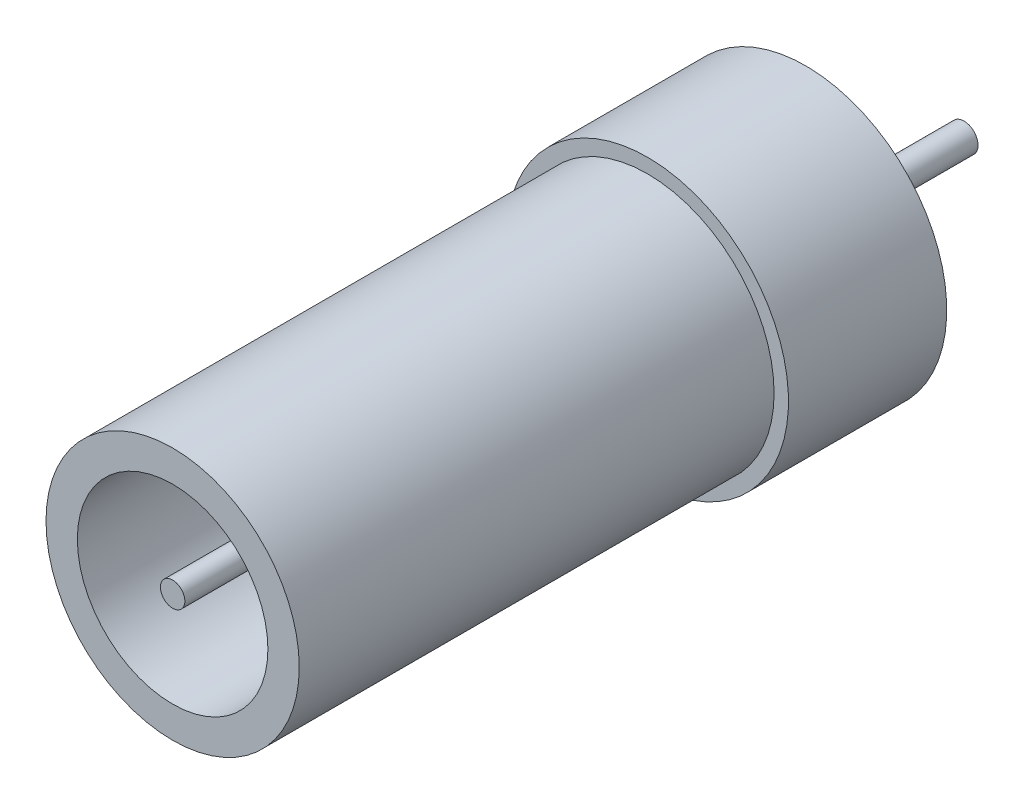
ISO-10303-21;
HEADER;
FILE_DESCRIPTION(('STEP AP214'),'2;1');
FILE_NAME('part.step','',(''),(''),'','','');
FILE_SCHEMA(('AUTOMOTIVE_DESIGN { 1 0 10303 214 1 1 1 1 }'));
ENDSEC;
DATA;
#1=APPLICATION_CONTEXT('core data for automotive mechanical design processes');
#2=APPLICATION_PROTOCOL_DEFINITION('international standard','automotive_design',2000,#1);
#3=PRODUCT_CONTEXT('',#1,'mechanical');
#4=PRODUCT('Part','Part','',(#3));
#5=PRODUCT_RELATED_PRODUCT_CATEGORY('part','',(#4));
#6=PRODUCT_DEFINITION_FORMATION('','',#4);
#7=PRODUCT_DEFINITION_CONTEXT('part definition',#1,'design');
#8=PRODUCT_DEFINITION('design','',#6,#7);
#9=PRODUCT_DEFINITION_SHAPE('','',#8);
#10=(LENGTH_UNIT() NAMED_UNIT(*) SI_UNIT(.MILLI.,.METRE.));
#11=(NAMED_UNIT(*) PLANE_ANGLE_UNIT() SI_UNIT($,.RADIAN.));
#12=(NAMED_UNIT(*) SI_UNIT($,.STERADIAN.) SOLID_ANGLE_UNIT());
#13=UNCERTAINTY_MEASURE_WITH_UNIT(LENGTH_MEASURE(1.E-05),#10,'distance_accuracy_value','');
#14=(GEOMETRIC_REPRESENTATION_CONTEXT(3) GLOBAL_UNCERTAINTY_ASSIGNED_CONTEXT((#13)) GLOBAL_UNIT_ASSIGNED_CONTEXT((#10,
#11,#12)) REPRESENTATION_CONTEXT('',''));
#15=CARTESIAN_POINT('',(0.,0.,0.));
#16=DIRECTION('',(0.,0.,1.));
#17=DIRECTION('',(1.,0.,0.));
#18=AXIS2_PLACEMENT_3D('',#15,#16,#17);
#19=CARTESIAN_POINT('',(0.,0.,15.));
#20=DIRECTION('',(0.,0.,1.));
#21=DIRECTION('',(1.,0.,0.));
#22=AXIS2_PLACEMENT_3D('',#19,#20,#21);
#23=PLANE('',#22);
#24=CARTESIAN_POINT('',(0.,0.,15.));
#25=DIRECTION('',(0.,0.,1.));
#26=DIRECTION('',(1.,0.,0.));
#27=AXIS2_PLACEMENT_3D('',#24,#25,#26);
#28=CIRCLE('',#27,3.00978243592516);
#29=CARTESIAN_POINT('',(3.00978243592516,0.,15.));
#30=VERTEX_POINT('',#29);
#31=EDGE_CURVE('E53',#30,#30,#28,.T.);
#32=ORIENTED_EDGE('',*,*,#31,.F.);
#33=EDGE_LOOP('',(#32));
#34=FACE_BOUND('',#33,.T.);
#35=CARTESIAN_POINT('',(0.,0.,15.));
#36=DIRECTION('',(0.,0.,1.));
#37=DIRECTION('',(1.,0.,0.));
#38=AXIS2_PLACEMENT_3D('',#35,#36,#37);
#39=CIRCLE('',#38,4.);
#40=CARTESIAN_POINT('',(4.,0.,15.));
#41=VERTEX_POINT('',#40);
#42=EDGE_CURVE('E10',#41,#41,#39,.T.);
#43=ORIENTED_EDGE('',*,*,#42,.T.);
#44=EDGE_LOOP('',(#43));
#45=FACE_BOUND('',#44,.T.);
#46=ADVANCED_FACE('F39',(#34,#45),#23,.T.);
#47=CARTESIAN_POINT('',(0.,0.,15.));
#48=DIRECTION('',(0.,0.,-1.));
#49=DIRECTION('',(-1.,0.,0.));
#50=AXIS2_PLACEMENT_3D('',#47,#48,#49);
#51=CYLINDRICAL_SURFACE('',#50,4.);
#52=ORIENTED_EDGE('',*,*,#42,.F.);
#53=EDGE_LOOP('',(#52));
#54=FACE_BOUND('',#53,.T.);
#55=CARTESIAN_POINT('',(0.,0.,0.));
#56=DIRECTION('',(0.,0.,1.));
#57=DIRECTION('',(1.,0.,0.));
#58=AXIS2_PLACEMENT_3D('',#55,#56,#57);
#59=CIRCLE('',#58,4.);
#60=CARTESIAN_POINT('',(4.,0.,0.));
#61=VERTEX_POINT('',#60);
#62=EDGE_CURVE('E43',#61,#61,#59,.T.);
#63=ORIENTED_EDGE('',*,*,#62,.T.);
#64=EDGE_LOOP('',(#63));
#65=FACE_BOUND('',#64,.T.);
#66=ADVANCED_FACE('F41',(#54,#65),#51,.T.);
#67=CARTESIAN_POINT('',(0.,0.,2.));
#68=DIRECTION('',(0.,0.,1.));
#69=DIRECTION('',(1.,0.,0.));
#70=AXIS2_PLACEMENT_3D('',#67,#68,#69);
#71=CYLINDRICAL_SURFACE('',#70,3.00978243592516);
#72=CARTESIAN_POINT('',(0.,0.,2.));
#73=DIRECTION('',(0.,0.,1.));
#74=DIRECTION('',(1.,0.,0.));
#75=AXIS2_PLACEMENT_3D('',#72,#73,#74);
#76=CIRCLE('',#75,3.00978243592516);
#77=CARTESIAN_POINT('',(3.00978243592516,0.,2.));
#78=VERTEX_POINT('',#77);
#79=EDGE_CURVE('E48',#78,#78,#76,.T.);
#80=CARTESIAN_POINT('',(3.00978243592516,0.,2.));
#81=CARTESIAN_POINT('',(3.00978243592516,0.,2.13541666666667));
#82=CARTESIAN_POINT('',(3.00978243592516,0.,2.27083333333333));
#83=CARTESIAN_POINT('',(3.00978243592516,0.,2.54166666666667));
#84=CARTESIAN_POINT('',(3.00978243592516,0.,2.67708333333333));
#85=CARTESIAN_POINT('',(3.00978243592516,0.,2.94791666666667));
#86=CARTESIAN_POINT('',(3.00978243592516,0.,3.08333333333333));
#87=CARTESIAN_POINT('',(3.00978243592516,0.,3.35416666666667));
#88=CARTESIAN_POINT('',(3.00978243592516,0.,3.48958333333333));
#89=CARTESIAN_POINT('',(3.00978243592516,0.,3.76041666666667));
#90=CARTESIAN_POINT('',(3.00978243592516,0.,3.89583333333333));
#91=CARTESIAN_POINT('',(3.00978243592516,0.,4.16666666666667));
#92=CARTESIAN_POINT('',(3.00978243592516,0.,4.30208333333333));
#93=CARTESIAN_POINT('',(3.00978243592516,0.,4.57291666666667));
#94=CARTESIAN_POINT('',(3.00978243592516,0.,4.70833333333333));
#95=CARTESIAN_POINT('',(3.00978243592516,0.,4.97916666666667));
#96=CARTESIAN_POINT('',(3.00978243592516,0.,5.11458333333333));
#97=CARTESIAN_POINT('',(3.00978243592516,0.,5.38541666666667));
#98=CARTESIAN_POINT('',(3.00978243592516,0.,5.52083333333333));
#99=CARTESIAN_POINT('',(3.00978243592516,0.,5.79166666666667));
#100=CARTESIAN_POINT('',(3.00978243592516,0.,5.92708333333333));
#101=CARTESIAN_POINT('',(3.00978243592516,0.,6.19791666666667));
#102=CARTESIAN_POINT('',(3.00978243592516,0.,6.33333333333333));
#103=CARTESIAN_POINT('',(3.00978243592516,0.,6.60416666666667));
#104=CARTESIAN_POINT('',(3.00978243592516,0.,6.73958333333333));
#105=CARTESIAN_POINT('',(3.00978243592516,0.,7.01041666666667));
#106=CARTESIAN_POINT('',(3.00978243592516,0.,7.14583333333333));
#107=CARTESIAN_POINT('',(3.00978243592516,0.,7.41666666666667));
#108=CARTESIAN_POINT('',(3.00978243592516,0.,7.55208333333333));
#109=CARTESIAN_POINT('',(3.00978243592516,0.,7.82291666666667));
#110=CARTESIAN_POINT('',(3.00978243592516,0.,7.95833333333333));
#111=CARTESIAN_POINT('',(3.00978243592516,0.,8.22916666666667));
#112=CARTESIAN_POINT('',(3.00978243592516,0.,8.36458333333333));
#113=CARTESIAN_POINT('',(3.00978243592516,0.,8.63541666666667));
#114=CARTESIAN_POINT('',(3.00978243592516,0.,8.77083333333333));
#115=CARTESIAN_POINT('',(3.00978243592516,0.,9.04166666666667));
#116=CARTESIAN_POINT('',(3.00978243592516,0.,9.17708333333333));
#117=CARTESIAN_POINT('',(3.00978243592516,0.,9.44791666666667));
#118=CARTESIAN_POINT('',(3.00978243592516,0.,9.58333333333333));
#119=CARTESIAN_POINT('',(3.00978243592516,0.,9.85416666666667));
#120=CARTESIAN_POINT('',(3.00978243592516,0.,9.98958333333333));
#121=CARTESIAN_POINT('',(3.00978243592516,0.,10.2604166666667));
#122=CARTESIAN_POINT('',(3.00978243592516,0.,10.3958333333333));
#123=CARTESIAN_POINT('',(3.00978243592516,0.,10.6666666666667));
#124=CARTESIAN_POINT('',(3.00978243592516,0.,10.8020833333333));
#125=CARTESIAN_POINT('',(3.00978243592516,0.,11.0729166666667));
#126=CARTESIAN_POINT('',(3.00978243592516,0.,11.2083333333333));
#127=CARTESIAN_POINT('',(3.00978243592516,0.,11.4791666666667));
#128=CARTESIAN_POINT('',(3.00978243592516,0.,11.6145833333333));
#129=CARTESIAN_POINT('',(3.00978243592516,0.,11.8854166666667));
#130=CARTESIAN_POINT('',(3.00978243592516,0.,12.0208333333333));
#131=CARTESIAN_POINT('',(3.00978243592516,0.,12.2916666666667));
#132=CARTESIAN_POINT('',(3.00978243592516,0.,12.4270833333333));
#133=CARTESIAN_POINT('',(3.00978243592516,0.,12.6979166666667));
#134=CARTESIAN_POINT('',(3.00978243592516,0.,12.8333333333333));
#135=CARTESIAN_POINT('',(3.00978243592516,0.,13.1041666666667));
#136=CARTESIAN_POINT('',(3.00978243592516,0.,13.2395833333333));
#137=CARTESIAN_POINT('',(3.00978243592516,0.,13.5104166666667));
#138=CARTESIAN_POINT('',(3.00978243592516,0.,13.6458333333333));
#139=CARTESIAN_POINT('',(3.00978243592516,0.,13.9166666666667));
#140=CARTESIAN_POINT('',(3.00978243592516,0.,14.0520833333333));
#141=CARTESIAN_POINT('',(3.00978243592516,0.,14.3229166666667));
#142=CARTESIAN_POINT('',(3.00978243592516,0.,14.4583333333333));
#143=CARTESIAN_POINT('',(3.00978243592516,0.,14.7291666666667));
#144=CARTESIAN_POINT('',(3.00978243592516,0.,14.8645833333333));
#145=CARTESIAN_POINT('',(3.00978243592516,0.,15.));
#146=B_SPLINE_CURVE_WITH_KNOTS('',3,(#80,#81,#82,#83,#84,#85,#86,#87,#88,#89,#90,#91,#92,#93,
#94,#95,#96,#97,#98,#99,#100,#101,#102,#103,#104,#105,#106,#107,#108,#109,#110,#111,#112,#113,
#114,#115,#116,#117,#118,#119,#120,#121,#122,#123,#124,#125,#126,#127,#128,#129,#130,#131,#132,
#133,#134,#135,#136,#137,#138,#139,#140,#141,#142,#143,#144,#145),.UNSPECIFIED.,.F.,.F.,(4,2,2,
2,2,2,2,2,2,2,2,2,2,2,2,2,2,2,2,2,2,2,2,2,2,2,2,2,2,2,2,2,4),(0.,0.40625,0.8125,1.21875,1.625,
2.03125,2.4375,2.84375,3.25,3.65625,4.0625,4.46875,4.875,5.28125,5.6875,6.09375,6.5,6.90625,
7.3125,7.71875,8.125,8.53125,8.9375,9.34375,9.75,10.15625,10.5625,10.96875,11.375,11.78125,
12.1875,12.59375,13.),.UNSPECIFIED.);
#147=EDGE_CURVE('BSEAM117',#78,#30,#146,.T.);
#148=ORIENTED_EDGE('',*,*,#79,.F.);
#149=ORIENTED_EDGE('',*,*,#31,.T.);
#150=ORIENTED_EDGE('',*,*,#147,.T.);
#151=ORIENTED_EDGE('',*,*,#147,.F.);
#152=EDGE_LOOP('',(#148,#150,#149,#151));
#153=FACE_BOUND('',#152,.T.);
#154=ADVANCED_FACE('F117',(#153),#71,.F.);
#155=CARTESIAN_POINT('',(0.,0.,2.));
#156=DIRECTION('',(0.,0.,1.));
#157=DIRECTION('',(1.,0.,0.));
#158=AXIS2_PLACEMENT_3D('',#155,#156,#157);
#159=PLANE('',#158);
#160=CARTESIAN_POINT('',(0.,0.,2.));
#161=DIRECTION('',(0.,0.,1.));
#162=DIRECTION('',(1.,0.,0.));
#163=AXIS2_PLACEMENT_3D('',#160,#161,#162);
#164=CIRCLE('',#163,0.386251132838802);
#165=CARTESIAN_POINT('',(0.386251132838802,0.,2.));
#166=VERTEX_POINT('',#165);
#167=EDGE_CURVE('E58',#166,#166,#164,.T.);
#168=ORIENTED_EDGE('',*,*,#167,.F.);
#169=EDGE_LOOP('',(#168));
#170=FACE_BOUND('',#169,.T.);
#171=ORIENTED_EDGE('',*,*,#79,.T.);
#172=EDGE_LOOP('',(#171));
#173=FACE_BOUND('',#172,.T.);
#174=ADVANCED_FACE('F127',(#170,#173),#159,.T.);
#175=CARTESIAN_POINT('',(0.,0.,2.));
#176=DIRECTION('',(0.,0.,1.));
#177=DIRECTION('',(1.,0.,0.));
#178=AXIS2_PLACEMENT_3D('',#175,#176,#177);
#179=CYLINDRICAL_SURFACE('',#178,0.386251132838802);
#180=ORIENTED_EDGE('',*,*,#167,.T.);
#181=EDGE_LOOP('',(#180));
#182=FACE_BOUND('',#181,.T.);
#183=CARTESIAN_POINT('',(0.,0.,15.));
#184=DIRECTION('',(0.,0.,1.));
#185=DIRECTION('',(1.,0.,0.));
#186=AXIS2_PLACEMENT_3D('',#183,#184,#185);
#187=CIRCLE('',#186,0.386251132838802);
#188=CARTESIAN_POINT('',(0.386251132838802,0.,15.));
#189=VERTEX_POINT('',#188);
#190=EDGE_CURVE('E60',#189,#189,#187,.T.);
#191=ORIENTED_EDGE('',*,*,#190,.F.);
#192=EDGE_LOOP('',(#191));
#193=FACE_BOUND('',#192,.T.);
#194=ADVANCED_FACE('F122',(#182,#193),#179,.T.);
#195=ORIENTED_EDGE('',*,*,#190,.T.);
#196=EDGE_LOOP('',(#195));
#197=FACE_BOUND('',#196,.T.);
#198=ADVANCED_FACE('F102',(#197),#23,.T.);
#199=CARTESIAN_POINT('',(0.,0.,-5.));
#200=DIRECTION('',(0.,0.,1.));
#201=DIRECTION('',(1.,0.,0.));
#202=AXIS2_PLACEMENT_3D('',#199,#200,#201);
#203=CYLINDRICAL_SURFACE('',#202,4.45410562371521);
#204=CARTESIAN_POINT('',(0.,0.,-5.));
#205=DIRECTION('',(0.,0.,-1.));
#206=DIRECTION('',(-1.,0.,0.));
#207=AXIS2_PLACEMENT_3D('',#204,#205,#206);
#208=CIRCLE('',#207,4.45410562371521);
#209=CARTESIAN_POINT('',(-4.45410562371521,0.,-5.));
#210=VERTEX_POINT('',#209);
#211=EDGE_CURVE('E71',#210,#210,#208,.T.);
#212=ORIENTED_EDGE('',*,*,#211,.F.);
#213=EDGE_LOOP('',(#212));
#214=FACE_BOUND('',#213,.T.);
#215=CARTESIAN_POINT('',(0.,0.,0.));
#216=DIRECTION('',(0.,0.,-1.));
#217=DIRECTION('',(-1.,0.,0.));
#218=AXIS2_PLACEMENT_3D('',#215,#216,#217);
#219=CIRCLE('',#218,4.45410562371521);
#220=CARTESIAN_POINT('',(-4.45410562371521,0.,0.));
#221=VERTEX_POINT('',#220);
#222=EDGE_CURVE('E67',#221,#221,#219,.T.);
#223=ORIENTED_EDGE('',*,*,#222,.T.);
#224=EDGE_LOOP('',(#223));
#225=FACE_BOUND('',#224,.T.);
#226=ADVANCED_FACE('F96',(#214,#225),#203,.T.);
#227=CARTESIAN_POINT('',(0.,0.,-5.));
#228=DIRECTION('',(0.,0.,-1.));
#229=DIRECTION('',(-1.,0.,0.));
#230=AXIS2_PLACEMENT_3D('',#227,#228,#229);
#231=PLANE('',#230);
#232=CARTESIAN_POINT('',(0.,0.,-5.));
#233=DIRECTION('',(0.,0.,-1.));
#234=DIRECTION('',(-1.,0.,0.));
#235=AXIS2_PLACEMENT_3D('',#232,#233,#234);
#236=CIRCLE('',#235,0.442435295883025);
#237=CARTESIAN_POINT('',(-0.442435295883025,0.,-5.));
#238=VERTEX_POINT('',#237);
#239=EDGE_CURVE('E76',#238,#238,#236,.T.);
#240=ORIENTED_EDGE('',*,*,#239,.F.);
#241=EDGE_LOOP('',(#240));
#242=FACE_BOUND('',#241,.T.);
#243=ORIENTED_EDGE('',*,*,#211,.T.);
#244=EDGE_LOOP('',(#243));
#245=FACE_BOUND('',#244,.T.);
#246=ADVANCED_FACE('F93',(#242,#245),#231,.T.);
#247=CARTESIAN_POINT('',(0.,0.,0.));
#248=DIRECTION('',(0.,0.,-1.));
#249=DIRECTION('',(-1.,0.,0.));
#250=AXIS2_PLACEMENT_3D('',#247,#248,#249);
#251=PLANE('',#250);
#252=ORIENTED_EDGE('',*,*,#62,.F.);
#253=EDGE_LOOP('',(#252));
#254=FACE_BOUND('',#253,.T.);
#255=ORIENTED_EDGE('',*,*,#222,.F.);
#256=EDGE_LOOP('',(#255));
#257=FACE_BOUND('',#256,.T.);
#258=ADVANCED_FACE('F89',(#254,#257),#251,.F.);
#259=CARTESIAN_POINT('',(0.,0.,-10.));
#260=DIRECTION('',(0.,0.,1.));
#261=DIRECTION('',(1.,0.,0.));
#262=AXIS2_PLACEMENT_3D('',#259,#260,#261);
#263=CYLINDRICAL_SURFACE('',#262,0.442435295883025);
#264=CARTESIAN_POINT('',(0.,0.,-10.));
#265=DIRECTION('',(0.,0.,-1.));
#266=DIRECTION('',(-1.,0.,0.));
#267=AXIS2_PLACEMENT_3D('',#264,#265,#266);
#268=CIRCLE('',#267,0.442435295883025);
#269=CARTESIAN_POINT('',(-0.442435295883025,0.,-10.));
#270=VERTEX_POINT('',#269);
#271=EDGE_CURVE('E72',#270,#270,#268,.T.);
#272=ORIENTED_EDGE('',*,*,#271,.F.);
#273=EDGE_LOOP('',(#272));
#274=FACE_BOUND('',#273,.T.);
#275=ORIENTED_EDGE('',*,*,#239,.T.);
#276=EDGE_LOOP('',(#275));
#277=FACE_BOUND('',#276,.T.);
#278=ADVANCED_FACE('F86',(#274,#277),#263,.T.);
#279=CARTESIAN_POINT('',(0.,0.,-10.));
#280=DIRECTION('',(0.,0.,-1.));
#281=DIRECTION('',(-1.,0.,0.));
#282=AXIS2_PLACEMENT_3D('',#279,#280,#281);
#283=PLANE('',#282);
#284=ORIENTED_EDGE('',*,*,#271,.T.);
#285=EDGE_LOOP('',(#284));
#286=FACE_BOUND('',#285,.T.);
#287=ADVANCED_FACE('F84',(#286),#283,.T.);
#288=CLOSED_SHELL('',(#46,#66,#154,#174,#194,#198,#226,#246,#258,#278,#287));
#289=MANIFOLD_SOLID_BREP('B2',#288);
#290=ADVANCED_BREP_SHAPE_REPRESENTATION('',(#18,#289),#14);
#291=SHAPE_DEFINITION_REPRESENTATION(#9,#290);
ENDSEC;
END-ISO-10303-21;
